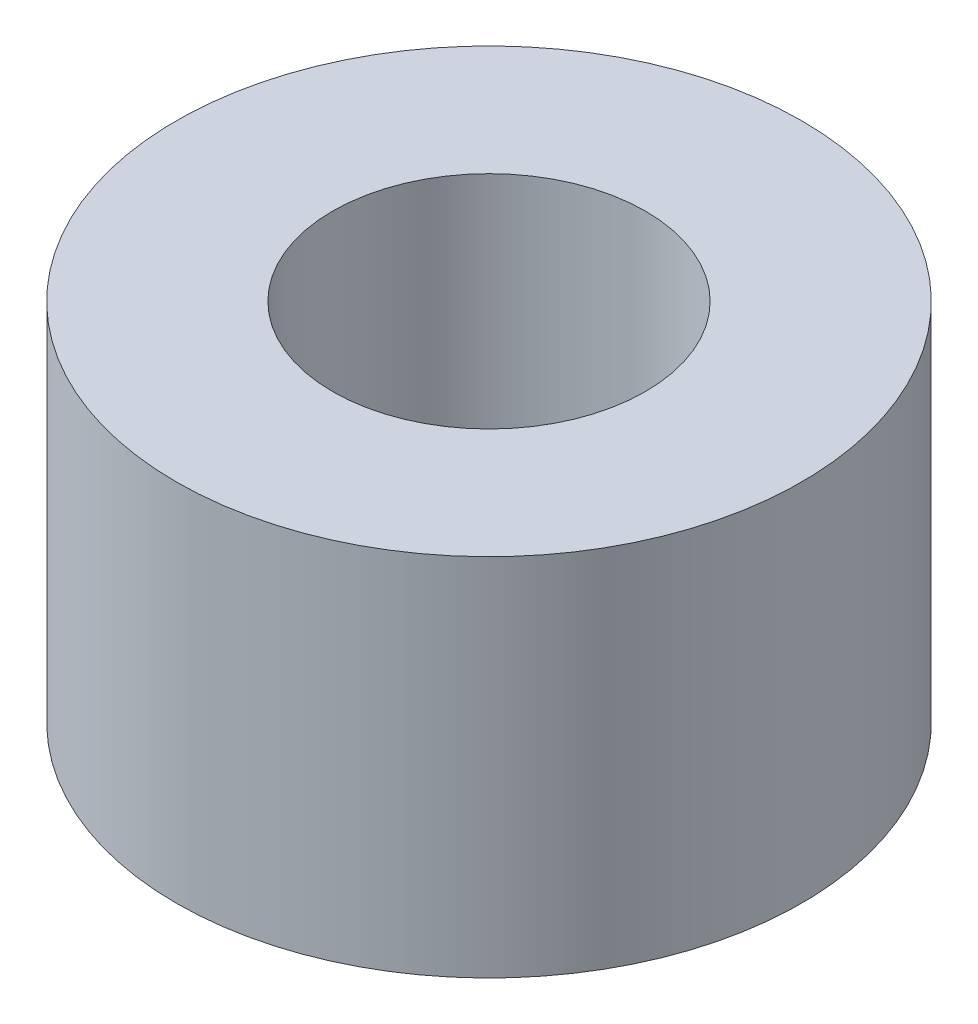
ISO-10303-21;
HEADER;
FILE_DESCRIPTION(('STEP AP214'),'2;1');
FILE_NAME('part.step','',(''),(''),'','','');
FILE_SCHEMA(('AUTOMOTIVE_DESIGN { 1 0 10303 214 1 1 1 1 }'));
ENDSEC;
DATA;
#1=APPLICATION_CONTEXT('core data for automotive mechanical design processes');
#2=APPLICATION_PROTOCOL_DEFINITION('international standard','automotive_design',2000,#1);
#3=PRODUCT_CONTEXT('',#1,'mechanical');
#4=PRODUCT('Part','Part','',(#3));
#5=PRODUCT_RELATED_PRODUCT_CATEGORY('part','',(#4));
#6=PRODUCT_DEFINITION_FORMATION('','',#4);
#7=PRODUCT_DEFINITION_CONTEXT('part definition',#1,'design');
#8=PRODUCT_DEFINITION('design','',#6,#7);
#9=PRODUCT_DEFINITION_SHAPE('','',#8);
#10=(LENGTH_UNIT() NAMED_UNIT(*) SI_UNIT(.MILLI.,.METRE.));
#11=(NAMED_UNIT(*) PLANE_ANGLE_UNIT() SI_UNIT($,.RADIAN.));
#12=(NAMED_UNIT(*) SI_UNIT($,.STERADIAN.) SOLID_ANGLE_UNIT());
#13=UNCERTAINTY_MEASURE_WITH_UNIT(LENGTH_MEASURE(1.E-05),#10,'distance_accuracy_value','');
#14=(GEOMETRIC_REPRESENTATION_CONTEXT(3) GLOBAL_UNCERTAINTY_ASSIGNED_CONTEXT((#13)) GLOBAL_UNIT_ASSIGNED_CONTEXT((#10,
#11,#12)) REPRESENTATION_CONTEXT('',''));
#15=CARTESIAN_POINT('',(0.,0.,0.));
#16=DIRECTION('',(0.,0.,1.));
#17=DIRECTION('',(1.,0.,0.));
#18=AXIS2_PLACEMENT_3D('',#15,#16,#17);
#19=CARTESIAN_POINT('',(0.,7.,0.));
#20=DIRECTION('',(0.,1.,0.));
#21=DIRECTION('',(0.,0.,1.));
#22=AXIS2_PLACEMENT_3D('',#19,#20,#21);
#23=PLANE('',#22);
#24=CARTESIAN_POINT('',(0.,7.,0.));
#25=DIRECTION('',(0.,1.,0.));
#26=DIRECTION('',(0.,0.,1.));
#27=AXIS2_PLACEMENT_3D('',#24,#25,#26);
#28=CIRCLE('',#27,6.);
#29=CARTESIAN_POINT('',(0.,7.,6.));
#30=VERTEX_POINT('',#29);
#31=EDGE_CURVE('E10',#30,#30,#28,.T.);
#32=ORIENTED_EDGE('',*,*,#31,.T.);
#33=EDGE_LOOP('',(#32));
#34=FACE_BOUND('',#33,.T.);
#35=CARTESIAN_POINT('',(0.,7.,0.));
#36=DIRECTION('',(0.,1.,0.));
#37=DIRECTION('',(0.,0.,1.));
#38=AXIS2_PLACEMENT_3D('',#35,#36,#37);
#39=CIRCLE('',#38,3.);
#40=CARTESIAN_POINT('',(0.,7.,3.));
#41=VERTEX_POINT('',#40);
#42=EDGE_CURVE('E50',#41,#41,#39,.T.);
#43=ORIENTED_EDGE('',*,*,#42,.F.);
#44=EDGE_LOOP('',(#43));
#45=FACE_BOUND('',#44,.T.);
#46=ADVANCED_FACE('F39',(#34,#45),#23,.T.);
#47=CARTESIAN_POINT('',(0.,0.,0.));
#48=DIRECTION('',(0.,1.,0.));
#49=DIRECTION('',(0.,0.,1.));
#50=AXIS2_PLACEMENT_3D('',#47,#48,#49);
#51=PLANE('',#50);
#52=CARTESIAN_POINT('',(0.,0.,0.));
#53=DIRECTION('',(0.,1.,0.));
#54=DIRECTION('',(0.,0.,1.));
#55=AXIS2_PLACEMENT_3D('',#52,#53,#54);
#56=CIRCLE('',#55,6.);
#57=CARTESIAN_POINT('',(0.,0.,6.));
#58=VERTEX_POINT('',#57);
#59=EDGE_CURVE('E43',#58,#58,#56,.T.);
#60=ORIENTED_EDGE('',*,*,#59,.F.);
#61=EDGE_LOOP('',(#60));
#62=FACE_BOUND('',#61,.T.);
#63=CARTESIAN_POINT('',(0.,0.,0.));
#64=DIRECTION('',(0.,1.,0.));
#65=DIRECTION('',(0.,0.,1.));
#66=AXIS2_PLACEMENT_3D('',#63,#64,#65);
#67=CIRCLE('',#66,3.);
#68=CARTESIAN_POINT('',(0.,0.,3.));
#69=VERTEX_POINT('',#68);
#70=EDGE_CURVE('E52',#69,#69,#67,.T.);
#71=ORIENTED_EDGE('',*,*,#70,.T.);
#72=EDGE_LOOP('',(#71));
#73=FACE_BOUND('',#72,.T.);
#74=ADVANCED_FACE('F62',(#62,#73),#51,.F.);
#75=CARTESIAN_POINT('',(0.,7.,0.));
#76=DIRECTION('',(0.,-1.,0.));
#77=DIRECTION('',(0.,0.,-1.));
#78=AXIS2_PLACEMENT_3D('',#75,#76,#77);
#79=CYLINDRICAL_SURFACE('',#78,6.);
#80=ORIENTED_EDGE('',*,*,#31,.F.);
#81=EDGE_LOOP('',(#80));
#82=FACE_BOUND('',#81,.T.);
#83=ORIENTED_EDGE('',*,*,#59,.T.);
#84=EDGE_LOOP('',(#83));
#85=FACE_BOUND('',#84,.T.);
#86=ADVANCED_FACE('F41',(#82,#85),#79,.T.);
#87=CARTESIAN_POINT('',(0.,7.,0.));
#88=DIRECTION('',(0.,-1.,0.));
#89=DIRECTION('',(0.,0.,-1.));
#90=AXIS2_PLACEMENT_3D('',#87,#88,#89);
#91=CYLINDRICAL_SURFACE('',#90,3.);
#92=ORIENTED_EDGE('',*,*,#42,.T.);
#93=EDGE_LOOP('',(#92));
#94=FACE_BOUND('',#93,.T.);
#95=ORIENTED_EDGE('',*,*,#70,.F.);
#96=EDGE_LOOP('',(#95));
#97=FACE_BOUND('',#96,.T.);
#98=ADVANCED_FACE('F58',(#94,#97),#91,.F.);
#99=CLOSED_SHELL('',(#46,#74,#86,#98));
#100=MANIFOLD_SOLID_BREP('B2',#99);
#101=ADVANCED_BREP_SHAPE_REPRESENTATION('',(#18,#100),#14);
#102=SHAPE_DEFINITION_REPRESENTATION(#9,#101);
ENDSEC;
END-ISO-10303-21;
